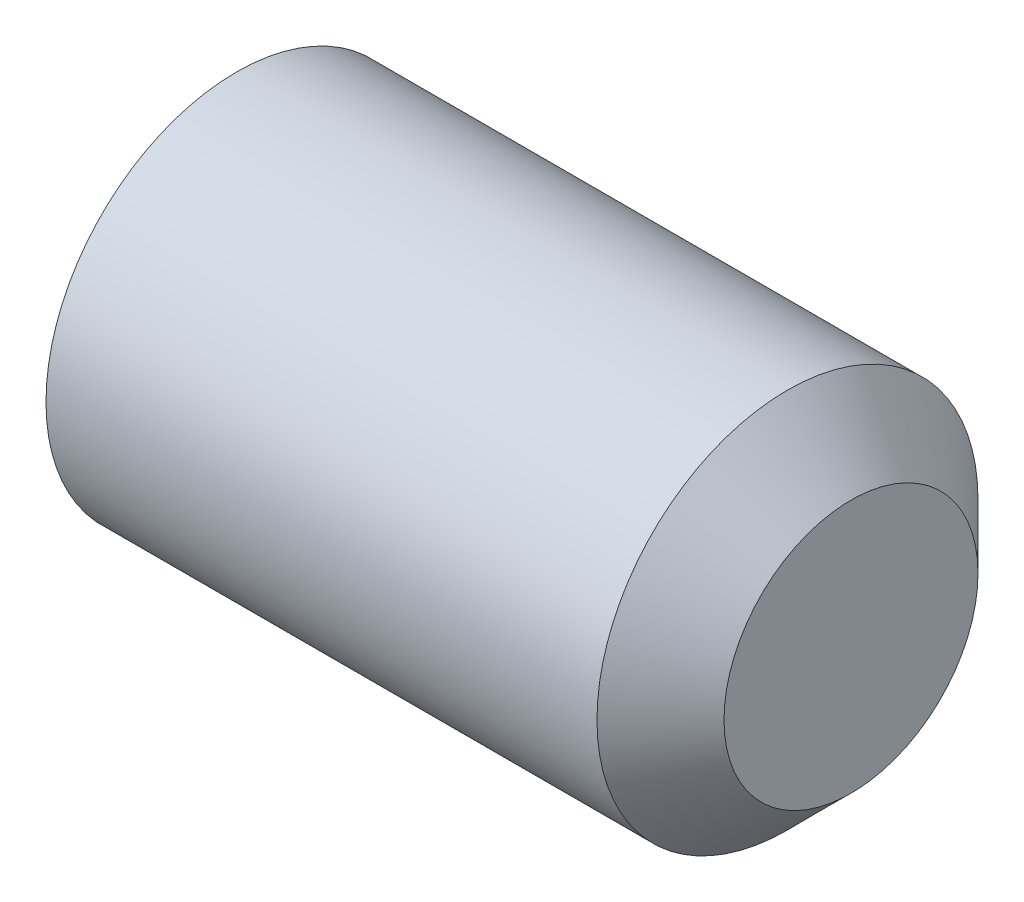
ISO-10303-21;
HEADER;
FILE_DESCRIPTION(('STEP AP214'),'2;1');
FILE_NAME('part.step','',(''),(''),'','','');
FILE_SCHEMA(('AUTOMOTIVE_DESIGN { 1 0 10303 214 1 1 1 1 }'));
ENDSEC;
DATA;
#1=APPLICATION_CONTEXT('core data for automotive mechanical design processes');
#2=APPLICATION_PROTOCOL_DEFINITION('international standard','automotive_design',2000,#1);
#3=PRODUCT_CONTEXT('',#1,'mechanical');
#4=PRODUCT('Part','Part','',(#3));
#5=PRODUCT_RELATED_PRODUCT_CATEGORY('part','',(#4));
#6=PRODUCT_DEFINITION_FORMATION('','',#4);
#7=PRODUCT_DEFINITION_CONTEXT('part definition',#1,'design');
#8=PRODUCT_DEFINITION('design','',#6,#7);
#9=PRODUCT_DEFINITION_SHAPE('','',#8);
#10=(LENGTH_UNIT() NAMED_UNIT(*) SI_UNIT(.MILLI.,.METRE.));
#11=(NAMED_UNIT(*) PLANE_ANGLE_UNIT() SI_UNIT($,.RADIAN.));
#12=(NAMED_UNIT(*) SI_UNIT($,.STERADIAN.) SOLID_ANGLE_UNIT());
#13=UNCERTAINTY_MEASURE_WITH_UNIT(LENGTH_MEASURE(1.E-05),#10,'distance_accuracy_value','');
#14=(GEOMETRIC_REPRESENTATION_CONTEXT(3) GLOBAL_UNCERTAINTY_ASSIGNED_CONTEXT((#13)) GLOBAL_UNIT_ASSIGNED_CONTEXT((#10,
#11,#12)) REPRESENTATION_CONTEXT('',''));
#15=CARTESIAN_POINT('',(0.,0.,0.));
#16=DIRECTION('',(0.,0.,1.));
#17=DIRECTION('',(1.,0.,0.));
#18=AXIS2_PLACEMENT_3D('',#15,#16,#17);
#19=CARTESIAN_POINT('',(0.,0.,0.));
#20=DIRECTION('',(-1.,0.,0.));
#21=DIRECTION('',(0.,0.,1.));
#22=AXIS2_PLACEMENT_3D('',#19,#20,#21);
#23=PLANE('',#22);
#24=CARTESIAN_POINT('',(0.,0.,0.));
#25=DIRECTION('',(-1.,0.,0.));
#26=DIRECTION('',(0.,0.,1.));
#27=AXIS2_PLACEMENT_3D('',#24,#25,#26);
#28=CIRCLE('',#27,1.2195);
#29=CARTESIAN_POINT('',(0.,0.,1.2195));
#30=VERTEX_POINT('',#29);
#31=EDGE_CURVE('E141',#30,#30,#28,.T.);
#32=ORIENTED_EDGE('',*,*,#31,.T.);
#33=EDGE_LOOP('',(#32));
#34=FACE_BOUND('',#33,.T.);
#35=DIRECTION('',(0.,0.,-1.));
#36=VECTOR('',#35,1.);
#37=CARTESIAN_POINT('',(0.,0.749999999999998,0.433012701892218));
#38=LINE('',#37,#36);
#39=CARTESIAN_POINT('',(0.,0.749999999999998,0.433012701892218));
#40=VERTEX_POINT('',#39);
#41=CARTESIAN_POINT('',(0.,0.749999999999998,-0.43301270189222));
#42=VERTEX_POINT('',#41);
#43=EDGE_CURVE('E132',#40,#42,#38,.T.);
#44=ORIENTED_EDGE('',*,*,#43,.F.);
#45=DIRECTION('',(0.,-0.866025403784439,0.5));
#46=VECTOR('',#45,1.);
#47=CARTESIAN_POINT('',(0.,0.749999999999998,0.433012701892218));
#48=LINE('',#47,#46);
#49=CARTESIAN_POINT('',(0.,0.,0.866025403784437));
#50=VERTEX_POINT('',#49);
#51=EDGE_CURVE('E54',#40,#50,#48,.T.);
#52=ORIENTED_EDGE('',*,*,#51,.T.);
#53=DIRECTION('',(0.,0.866025403784439,0.5));
#54=VECTOR('',#53,1.);
#55=CARTESIAN_POINT('',(0.,-0.750000000000002,0.433012701892218));
#56=LINE('',#55,#54);
#57=CARTESIAN_POINT('',(0.,-0.750000000000002,0.433012701892218));
#58=VERTEX_POINT('',#57);
#59=EDGE_CURVE('E123',#58,#50,#56,.T.);
#60=ORIENTED_EDGE('',*,*,#59,.F.);
#61=DIRECTION('',(0.,0.,-1.));
#62=VECTOR('',#61,1.);
#63=CARTESIAN_POINT('',(0.,-0.750000000000002,0.433012701892218));
#64=LINE('',#63,#62);
#65=CARTESIAN_POINT('',(0.,-0.750000000000002,-0.43301270189222));
#66=VERTEX_POINT('',#65);
#67=EDGE_CURVE('E126',#58,#66,#64,.T.);
#68=ORIENTED_EDGE('',*,*,#67,.T.);
#69=DIRECTION('',(0.,0.866025403784439,-0.5));
#70=VECTOR('',#69,1.);
#71=CARTESIAN_POINT('',(0.,-0.750000000000002,-0.43301270189222));
#72=LINE('',#71,#70);
#73=CARTESIAN_POINT('',(0.,0.,-0.86602540378444));
#74=VERTEX_POINT('',#73);
#75=EDGE_CURVE('E129',#66,#74,#72,.T.);
#76=ORIENTED_EDGE('',*,*,#75,.T.);
#77=DIRECTION('',(0.,-0.866025403784439,-0.5));
#78=VECTOR('',#77,1.);
#79=CARTESIAN_POINT('',(0.,0.749999999999998,-0.43301270189222));
#80=LINE('',#79,#78);
#81=EDGE_CURVE('E112',#42,#74,#80,.T.);
#82=ORIENTED_EDGE('',*,*,#81,.F.);
#83=EDGE_LOOP('',(#44,#52,#60,#68,#76,#82));
#84=FACE_BOUND('',#83,.T.);
#85=ADVANCED_FACE('F39',(#34,#84),#23,.T.);
#86=CARTESIAN_POINT('',(5.,1.,0.));
#87=DIRECTION('',(1.,0.,0.));
#88=DIRECTION('',(0.,0.,-1.));
#89=AXIS2_PLACEMENT_3D('',#86,#87,#88);
#90=PLANE('',#89);
#91=CARTESIAN_POINT('',(5.,0.,0.));
#92=DIRECTION('',(-1.,0.,0.));
#93=DIRECTION('',(0.,0.,1.));
#94=AXIS2_PLACEMENT_3D('',#91,#92,#93);
#95=CIRCLE('',#94,1.);
#96=CARTESIAN_POINT('',(5.,0.,1.));
#97=VERTEX_POINT('',#96);
#98=EDGE_CURVE('E11',#97,#97,#95,.T.);
#99=ORIENTED_EDGE('',*,*,#98,.F.);
#100=EDGE_LOOP('',(#99));
#101=FACE_BOUND('',#100,.T.);
#102=ADVANCED_FACE('F41',(#101),#90,.T.);
#103=CARTESIAN_POINT('',(4.5,0.,0.));
#104=DIRECTION('',(-1.,0.,0.));
#105=DIRECTION('',(0.,0.,1.));
#106=AXIS2_PLACEMENT_3D('',#103,#104,#105);
#107=CONICAL_SURFACE('',#106,1.5,0.785398163397448);
#108=ORIENTED_EDGE('',*,*,#98,.T.);
#109=EDGE_LOOP('',(#108));
#110=FACE_BOUND('',#109,.T.);
#111=CARTESIAN_POINT('',(4.5,0.,0.));
#112=DIRECTION('',(-1.,0.,0.));
#113=DIRECTION('',(0.,0.,1.));
#114=AXIS2_PLACEMENT_3D('',#111,#112,#113);
#115=CIRCLE('',#114,1.5);
#116=CARTESIAN_POINT('',(4.5,0.,1.5));
#117=VERTEX_POINT('',#116);
#118=EDGE_CURVE('E47',#117,#117,#115,.T.);
#119=ORIENTED_EDGE('',*,*,#118,.F.);
#120=EDGE_LOOP('',(#119));
#121=FACE_BOUND('',#120,.T.);
#122=ADVANCED_FACE('F152',(#110,#121),#107,.T.);
#123=CARTESIAN_POINT('',(-12.7,0.,0.));
#124=DIRECTION('',(-1.,0.,0.));
#125=DIRECTION('',(0.,0.,1.));
#126=AXIS2_PLACEMENT_3D('',#123,#124,#125);
#127=CYLINDRICAL_SURFACE('',#126,1.5);
#128=ORIENTED_EDGE('',*,*,#118,.T.);
#129=EDGE_LOOP('',(#128));
#130=FACE_BOUND('',#129,.T.);
#131=CARTESIAN_POINT('',(0.16194675050769,0.,0.));
#132=DIRECTION('',(-1.,0.,0.));
#133=DIRECTION('',(0.,0.,1.));
#134=AXIS2_PLACEMENT_3D('',#131,#132,#133);
#135=CIRCLE('',#134,1.5);
#136=CARTESIAN_POINT('',(0.16194675050769,0.,1.5));
#137=VERTEX_POINT('',#136);
#138=EDGE_CURVE('E144',#137,#137,#135,.T.);
#139=ORIENTED_EDGE('',*,*,#138,.F.);
#140=EDGE_LOOP('',(#139));
#141=FACE_BOUND('',#140,.T.);
#142=ADVANCED_FACE('F149',(#130,#141),#127,.T.);
#143=CARTESIAN_POINT('',(0.,0.,0.));
#144=DIRECTION('',(1.,0.,0.));
#145=DIRECTION('',(0.,0.,-1.));
#146=AXIS2_PLACEMENT_3D('',#143,#144,#145);
#147=CONICAL_SURFACE('',#146,1.2195,1.0471975511966);
#148=ORIENTED_EDGE('',*,*,#138,.T.);
#149=EDGE_LOOP('',(#148));
#150=FACE_BOUND('',#149,.T.);
#151=ORIENTED_EDGE('',*,*,#31,.F.);
#152=EDGE_LOOP('',(#151));
#153=FACE_BOUND('',#152,.T.);
#154=ADVANCED_FACE('F159',(#150,#153),#147,.T.);
#155=CARTESIAN_POINT('',(2.,0.749999999999998,0.433012701892218));
#156=DIRECTION('',(0.,-0.5,-0.866025403784439));
#157=DIRECTION('',(0.,0.866025403784439,-0.5));
#158=AXIS2_PLACEMENT_3D('',#155,#156,#157);
#159=PLANE('',#158);
#160=ORIENTED_EDGE('',*,*,#51,.F.);
#161=DIRECTION('',(-1.,0.,0.));
#162=VECTOR('',#161,1.);
#163=CARTESIAN_POINT('',(2.,0.749999999999998,0.433012701892218));
#164=LINE('',#163,#162);
#165=CARTESIAN_POINT('',(2.,0.749999999999998,0.433012701892218));
#166=VERTEX_POINT('',#165);
#167=EDGE_CURVE('E59',#166,#40,#164,.T.);
#168=ORIENTED_EDGE('',*,*,#167,.F.);
#169=DIRECTION('',(0.,-0.866025403784439,0.5));
#170=VECTOR('',#169,1.);
#171=CARTESIAN_POINT('',(2.,0.749999999999998,0.433012701892218));
#172=LINE('',#171,#170);
#173=CARTESIAN_POINT('',(2.,0.,0.866025403784437));
#174=VERTEX_POINT('',#173);
#175=EDGE_CURVE('E86',#166,#174,#172,.T.);
#176=ORIENTED_EDGE('',*,*,#175,.T.);
#177=DIRECTION('',(-1.,0.,0.));
#178=VECTOR('',#177,1.);
#179=CARTESIAN_POINT('',(2.,0.,0.866025403784437));
#180=LINE('',#179,#178);
#181=EDGE_CURVE('E139',#174,#50,#180,.T.);
#182=ORIENTED_EDGE('',*,*,#181,.T.);
#183=EDGE_LOOP('',(#160,#168,#176,#182));
#184=FACE_BOUND('',#183,.T.);
#185=ADVANCED_FACE('F170',(#184),#159,.T.);
#186=CARTESIAN_POINT('',(2.,-0.750000000000002,0.433012701892218));
#187=DIRECTION('',(0.,-0.5,0.866025403784439));
#188=DIRECTION('',(0.,-0.866025403784439,-0.5));
#189=AXIS2_PLACEMENT_3D('',#186,#187,#188);
#190=PLANE('',#189);
#191=ORIENTED_EDGE('',*,*,#59,.T.);
#192=ORIENTED_EDGE('',*,*,#181,.F.);
#193=DIRECTION('',(0.,0.866025403784439,0.5));
#194=VECTOR('',#193,1.);
#195=CARTESIAN_POINT('',(2.,-0.750000000000002,0.433012701892218));
#196=LINE('',#195,#194);
#197=CARTESIAN_POINT('',(2.,-0.750000000000002,0.433012701892218));
#198=VERTEX_POINT('',#197);
#199=EDGE_CURVE('E294',#198,#174,#196,.T.);
#200=ORIENTED_EDGE('',*,*,#199,.F.);
#201=DIRECTION('',(-1.,0.,0.));
#202=VECTOR('',#201,1.);
#203=CARTESIAN_POINT('',(2.,-0.750000000000002,0.433012701892218));
#204=LINE('',#203,#202);
#205=EDGE_CURVE('E137',#198,#58,#204,.T.);
#206=ORIENTED_EDGE('',*,*,#205,.T.);
#207=EDGE_LOOP('',(#191,#192,#200,#206));
#208=FACE_BOUND('',#207,.T.);
#209=ADVANCED_FACE('F177',(#208),#190,.F.);
#210=CARTESIAN_POINT('',(2.,-0.750000000000002,0.433012701892218));
#211=DIRECTION('',(0.,1.,0.));
#212=DIRECTION('',(0.,0.,1.));
#213=AXIS2_PLACEMENT_3D('',#210,#211,#212);
#214=PLANE('',#213);
#215=ORIENTED_EDGE('',*,*,#67,.F.);
#216=ORIENTED_EDGE('',*,*,#205,.F.);
#217=DIRECTION('',(0.,0.,-1.));
#218=VECTOR('',#217,1.);
#219=CARTESIAN_POINT('',(2.,-0.750000000000002,0.433012701892218));
#220=LINE('',#219,#218);
#221=CARTESIAN_POINT('',(2.,-0.750000000000002,-0.43301270189222));
#222=VERTEX_POINT('',#221);
#223=EDGE_CURVE('E107',#198,#222,#220,.T.);
#224=ORIENTED_EDGE('',*,*,#223,.T.);
#225=DIRECTION('',(-1.,0.,0.));
#226=VECTOR('',#225,1.);
#227=CARTESIAN_POINT('',(2.,-0.750000000000002,-0.43301270189222));
#228=LINE('',#227,#226);
#229=EDGE_CURVE('E102',#222,#66,#228,.T.);
#230=ORIENTED_EDGE('',*,*,#229,.T.);
#231=EDGE_LOOP('',(#215,#216,#224,#230));
#232=FACE_BOUND('',#231,.T.);
#233=ADVANCED_FACE('F184',(#232),#214,.T.);
#234=CARTESIAN_POINT('',(2.,-0.750000000000002,-0.43301270189222));
#235=DIRECTION('',(0.,0.5,0.866025403784439));
#236=DIRECTION('',(0.,-0.866025403784439,0.5));
#237=AXIS2_PLACEMENT_3D('',#234,#235,#236);
#238=PLANE('',#237);
#239=ORIENTED_EDGE('',*,*,#75,.F.);
#240=ORIENTED_EDGE('',*,*,#229,.F.);
#241=DIRECTION('',(0.,0.866025403784439,-0.5));
#242=VECTOR('',#241,1.);
#243=CARTESIAN_POINT('',(2.,-0.750000000000002,-0.43301270189222));
#244=LINE('',#243,#242);
#245=CARTESIAN_POINT('',(2.,0.,-0.86602540378444));
#246=VERTEX_POINT('',#245);
#247=EDGE_CURVE('E97',#222,#246,#244,.T.);
#248=ORIENTED_EDGE('',*,*,#247,.T.);
#249=DIRECTION('',(-1.,0.,0.));
#250=VECTOR('',#249,1.);
#251=CARTESIAN_POINT('',(2.,0.,-0.86602540378444));
#252=LINE('',#251,#250);
#253=EDGE_CURVE('E101',#246,#74,#252,.T.);
#254=ORIENTED_EDGE('',*,*,#253,.T.);
#255=EDGE_LOOP('',(#239,#240,#248,#254));
#256=FACE_BOUND('',#255,.T.);
#257=ADVANCED_FACE('F100',(#256),#238,.T.);
#258=CARTESIAN_POINT('',(2.,0.749999999999998,-0.43301270189222));
#259=DIRECTION('',(0.,0.5,-0.866025403784439));
#260=DIRECTION('',(0.,0.866025403784439,0.5));
#261=AXIS2_PLACEMENT_3D('',#258,#259,#260);
#262=PLANE('',#261);
#263=ORIENTED_EDGE('',*,*,#81,.T.);
#264=ORIENTED_EDGE('',*,*,#253,.F.);
#265=DIRECTION('',(0.,-0.866025403784439,-0.5));
#266=VECTOR('',#265,1.);
#267=CARTESIAN_POINT('',(2.,0.749999999999998,-0.43301270189222));
#268=LINE('',#267,#266);
#269=CARTESIAN_POINT('',(2.,0.749999999999998,-0.43301270189222));
#270=VERTEX_POINT('',#269);
#271=EDGE_CURVE('E106',#270,#246,#268,.T.);
#272=ORIENTED_EDGE('',*,*,#271,.F.);
#273=DIRECTION('',(-1.,0.,0.));
#274=VECTOR('',#273,1.);
#275=CARTESIAN_POINT('',(2.,0.749999999999998,-0.43301270189222));
#276=LINE('',#275,#274);
#277=EDGE_CURVE('E82',#270,#42,#276,.T.);
#278=ORIENTED_EDGE('',*,*,#277,.T.);
#279=EDGE_LOOP('',(#263,#264,#272,#278));
#280=FACE_BOUND('',#279,.T.);
#281=ADVANCED_FACE('F109',(#280),#262,.F.);
#282=CARTESIAN_POINT('',(2.,0.749999999999998,0.433012701892218));
#283=DIRECTION('',(0.,1.,0.));
#284=DIRECTION('',(0.,0.,1.));
#285=AXIS2_PLACEMENT_3D('',#282,#283,#284);
#286=PLANE('',#285);
#287=ORIENTED_EDGE('',*,*,#43,.T.);
#288=ORIENTED_EDGE('',*,*,#277,.F.);
#289=DIRECTION('',(0.,0.,-1.));
#290=VECTOR('',#289,1.);
#291=CARTESIAN_POINT('',(2.,0.749999999999998,0.433012701892218));
#292=LINE('',#291,#290);
#293=EDGE_CURVE('E117',#166,#270,#292,.T.);
#294=ORIENTED_EDGE('',*,*,#293,.F.);
#295=ORIENTED_EDGE('',*,*,#167,.T.);
#296=EDGE_LOOP('',(#287,#288,#294,#295));
#297=FACE_BOUND('',#296,.T.);
#298=ADVANCED_FACE('F196',(#297),#286,.F.);
#299=CARTESIAN_POINT('',(2.,0.749999999999998,0.433012701892218));
#300=DIRECTION('',(1.,0.,0.));
#301=DIRECTION('',(0.,0.,-1.));
#302=AXIS2_PLACEMENT_3D('',#299,#300,#301);
#303=PLANE('',#302);
#304=ORIENTED_EDGE('',*,*,#175,.F.);
#305=ORIENTED_EDGE('',*,*,#293,.T.);
#306=ORIENTED_EDGE('',*,*,#271,.T.);
#307=ORIENTED_EDGE('',*,*,#247,.F.);
#308=ORIENTED_EDGE('',*,*,#223,.F.);
#309=ORIENTED_EDGE('',*,*,#199,.T.);
#310=EDGE_LOOP('',(#304,#305,#306,#307,#308,#309));
#311=FACE_BOUND('',#310,.T.);
#312=ADVANCED_FACE('F115',(#311),#303,.F.);
#313=CLOSED_SHELL('',(#85,#102,#122,#142,#154,#185,#209,#233,#257,#281,#298,#312));
#314=MANIFOLD_SOLID_BREP('B2',#313);
#315=ADVANCED_BREP_SHAPE_REPRESENTATION('',(#18,#314),#14);
#316=SHAPE_DEFINITION_REPRESENTATION(#9,#315);
ENDSEC;
END-ISO-10303-21;
